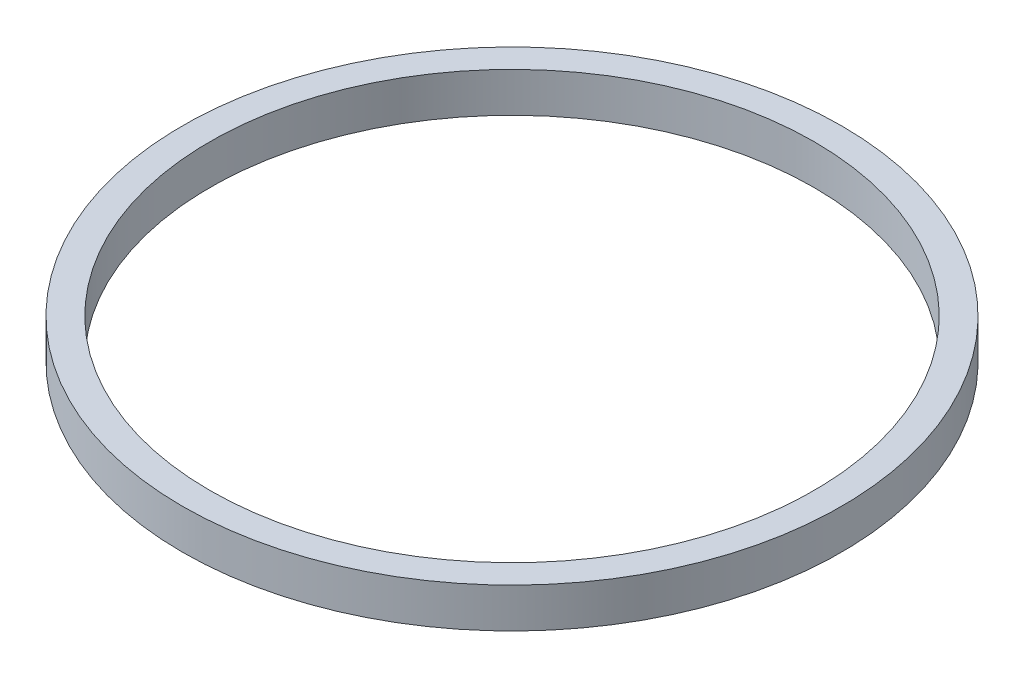
ISO-10303-21;
HEADER;
FILE_DESCRIPTION(('STEP AP214'),'2;1');
FILE_NAME('part.step','',(''),(''),'','','');
FILE_SCHEMA(('AUTOMOTIVE_DESIGN { 1 0 10303 214 1 1 1 1 }'));
ENDSEC;
DATA;
#1=APPLICATION_CONTEXT('core data for automotive mechanical design processes');
#2=APPLICATION_PROTOCOL_DEFINITION('international standard','automotive_design',2000,#1);
#3=PRODUCT_CONTEXT('',#1,'mechanical');
#4=PRODUCT('Part','Part','',(#3));
#5=PRODUCT_RELATED_PRODUCT_CATEGORY('part','',(#4));
#6=PRODUCT_DEFINITION_FORMATION('','',#4);
#7=PRODUCT_DEFINITION_CONTEXT('part definition',#1,'design');
#8=PRODUCT_DEFINITION('design','',#6,#7);
#9=PRODUCT_DEFINITION_SHAPE('','',#8);
#10=(LENGTH_UNIT() NAMED_UNIT(*) SI_UNIT(.MILLI.,.METRE.));
#11=(NAMED_UNIT(*) PLANE_ANGLE_UNIT() SI_UNIT($,.RADIAN.));
#12=(NAMED_UNIT(*) SI_UNIT($,.STERADIAN.) SOLID_ANGLE_UNIT());
#13=UNCERTAINTY_MEASURE_WITH_UNIT(LENGTH_MEASURE(1.E-05),#10,'distance_accuracy_value','');
#14=(GEOMETRIC_REPRESENTATION_CONTEXT(3) GLOBAL_UNCERTAINTY_ASSIGNED_CONTEXT((#13)) GLOBAL_UNIT_ASSIGNED_CONTEXT((#10,
#11,#12)) REPRESENTATION_CONTEXT('',''));
#15=CARTESIAN_POINT('',(0.,0.,0.));
#16=DIRECTION('',(0.,0.,1.));
#17=DIRECTION('',(1.,0.,0.));
#18=AXIS2_PLACEMENT_3D('',#15,#16,#17);
#19=CARTESIAN_POINT('',(0.,3.62,0.));
#20=DIRECTION('',(0.,-1.,0.));
#21=DIRECTION('',(0.,0.,-1.));
#22=AXIS2_PLACEMENT_3D('',#19,#20,#21);
#23=CYLINDRICAL_SURFACE('',#22,30.);
#24=CARTESIAN_POINT('',(0.,3.62,0.));
#25=DIRECTION('',(0.,1.,0.));
#26=DIRECTION('',(0.,0.,1.));
#27=AXIS2_PLACEMENT_3D('',#24,#25,#26);
#28=CIRCLE('',#27,30.);
#29=CARTESIAN_POINT('',(0.,3.62,30.));
#30=VERTEX_POINT('',#29);
#31=EDGE_CURVE('E10',#30,#30,#28,.T.);
#32=ORIENTED_EDGE('',*,*,#31,.F.);
#33=EDGE_LOOP('',(#32));
#34=FACE_BOUND('',#33,.T.);
#35=CARTESIAN_POINT('',(0.,0.,0.));
#36=DIRECTION('',(0.,1.,0.));
#37=DIRECTION('',(0.,0.,1.));
#38=AXIS2_PLACEMENT_3D('',#35,#36,#37);
#39=CIRCLE('',#38,30.);
#40=CARTESIAN_POINT('',(0.,0.,30.));
#41=VERTEX_POINT('',#40);
#42=EDGE_CURVE('E34',#41,#41,#39,.T.);
#43=ORIENTED_EDGE('',*,*,#42,.T.);
#44=EDGE_LOOP('',(#43));
#45=FACE_BOUND('',#44,.T.);
#46=ADVANCED_FACE('F31',(#34,#45),#23,.T.);
#47=CARTESIAN_POINT('',(0.,3.62,0.));
#48=DIRECTION('',(0.,1.,0.));
#49=DIRECTION('',(0.,0.,1.));
#50=AXIS2_PLACEMENT_3D('',#47,#48,#49);
#51=PLANE('',#50);
#52=CARTESIAN_POINT('',(0.,3.62,0.));
#53=DIRECTION('',(0.,1.,0.));
#54=DIRECTION('',(0.,0.,1.));
#55=AXIS2_PLACEMENT_3D('',#52,#53,#54);
#56=CIRCLE('',#55,27.5);
#57=CARTESIAN_POINT('',(0.,3.62,27.5));
#58=VERTEX_POINT('',#57);
#59=EDGE_CURVE('E43',#58,#58,#56,.T.);
#60=ORIENTED_EDGE('',*,*,#59,.F.);
#61=EDGE_LOOP('',(#60));
#62=FACE_BOUND('',#61,.T.);
#63=ORIENTED_EDGE('',*,*,#31,.T.);
#64=EDGE_LOOP('',(#63));
#65=FACE_BOUND('',#64,.T.);
#66=ADVANCED_FACE('F58',(#62,#65),#51,.T.);
#67=CARTESIAN_POINT('',(0.,0.,0.));
#68=DIRECTION('',(0.,1.,0.));
#69=DIRECTION('',(0.,0.,1.));
#70=AXIS2_PLACEMENT_3D('',#67,#68,#69);
#71=PLANE('',#70);
#72=CARTESIAN_POINT('',(0.,0.,0.));
#73=DIRECTION('',(0.,1.,0.));
#74=DIRECTION('',(0.,0.,1.));
#75=AXIS2_PLACEMENT_3D('',#72,#73,#74);
#76=CIRCLE('',#75,27.5);
#77=CARTESIAN_POINT('',(0.,0.,27.5));
#78=VERTEX_POINT('',#77);
#79=EDGE_CURVE('E41',#78,#78,#76,.T.);
#80=ORIENTED_EDGE('',*,*,#79,.T.);
#81=EDGE_LOOP('',(#80));
#82=FACE_BOUND('',#81,.T.);
#83=ORIENTED_EDGE('',*,*,#42,.F.);
#84=EDGE_LOOP('',(#83));
#85=FACE_BOUND('',#84,.T.);
#86=ADVANCED_FACE('F49',(#82,#85),#71,.F.);
#87=CARTESIAN_POINT('',(0.,0.,0.));
#88=DIRECTION('',(0.,1.,0.));
#89=DIRECTION('',(0.,0.,1.));
#90=AXIS2_PLACEMENT_3D('',#87,#88,#89);
#91=CYLINDRICAL_SURFACE('',#90,27.5);
#92=ORIENTED_EDGE('',*,*,#79,.F.);
#93=EDGE_LOOP('',(#92));
#94=FACE_BOUND('',#93,.T.);
#95=ORIENTED_EDGE('',*,*,#59,.T.);
#96=EDGE_LOOP('',(#95));
#97=FACE_BOUND('',#96,.T.);
#98=ADVANCED_FACE('F52',(#94,#97),#91,.F.);
#99=CLOSED_SHELL('',(#46,#66,#86,#98));
#100=MANIFOLD_SOLID_BREP('B2',#99);
#101=ADVANCED_BREP_SHAPE_REPRESENTATION('',(#18,#100),#14);
#102=SHAPE_DEFINITION_REPRESENTATION(#9,#101);
ENDSEC;
END-ISO-10303-21;
